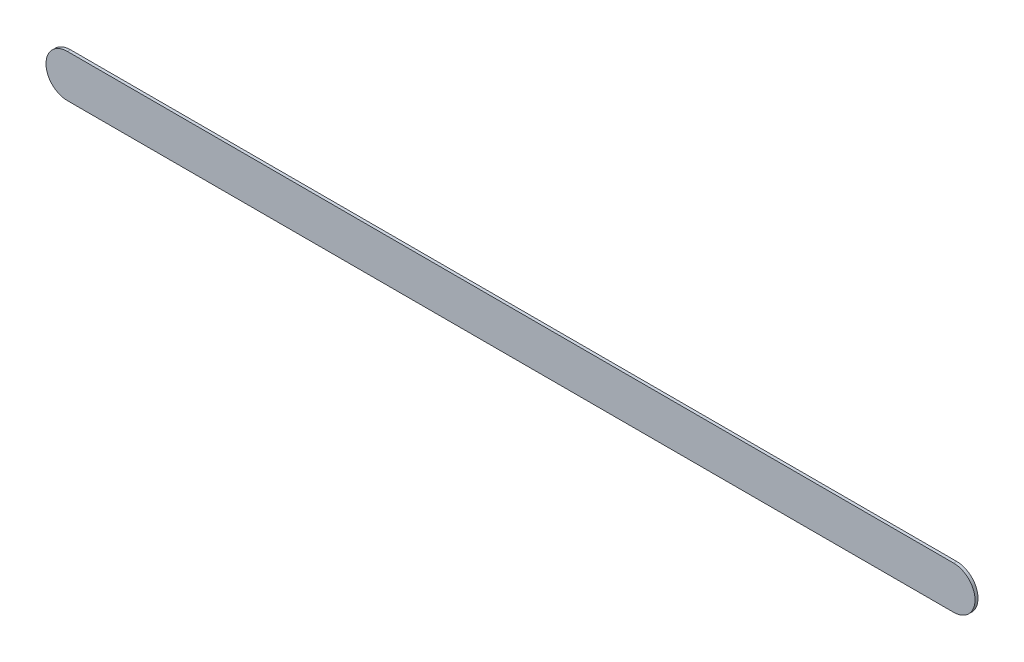
ISO-10303-21;
HEADER;
FILE_DESCRIPTION(('STEP AP214'),'2;1');
FILE_NAME('part.step','',(''),(''),'','','');
FILE_SCHEMA(('AUTOMOTIVE_DESIGN { 1 0 10303 214 1 1 1 1 }'));
ENDSEC;
DATA;
#1=APPLICATION_CONTEXT('core data for automotive mechanical design processes');
#2=APPLICATION_PROTOCOL_DEFINITION('international standard','automotive_design',2000,#1);
#3=PRODUCT_CONTEXT('',#1,'mechanical');
#4=PRODUCT('Part','Part','',(#3));
#5=PRODUCT_RELATED_PRODUCT_CATEGORY('part','',(#4));
#6=PRODUCT_DEFINITION_FORMATION('','',#4);
#7=PRODUCT_DEFINITION_CONTEXT('part definition',#1,'design');
#8=PRODUCT_DEFINITION('design','',#6,#7);
#9=PRODUCT_DEFINITION_SHAPE('','',#8);
#10=(LENGTH_UNIT() NAMED_UNIT(*) SI_UNIT(.MILLI.,.METRE.));
#11=(NAMED_UNIT(*) PLANE_ANGLE_UNIT() SI_UNIT($,.RADIAN.));
#12=(NAMED_UNIT(*) SI_UNIT($,.STERADIAN.) SOLID_ANGLE_UNIT());
#13=UNCERTAINTY_MEASURE_WITH_UNIT(LENGTH_MEASURE(1.E-05),#10,'distance_accuracy_value','');
#14=(GEOMETRIC_REPRESENTATION_CONTEXT(3) GLOBAL_UNCERTAINTY_ASSIGNED_CONTEXT((#13)) GLOBAL_UNIT_ASSIGNED_CONTEXT((#10,
#11,#12)) REPRESENTATION_CONTEXT('',''));
#15=CARTESIAN_POINT('',(0.,0.,0.));
#16=DIRECTION('',(0.,0.,1.));
#17=DIRECTION('',(1.,0.,0.));
#18=AXIS2_PLACEMENT_3D('',#15,#16,#17);
#19=CARTESIAN_POINT('',(137.66,-56.63,1.635));
#20=DIRECTION('',(0.,0.,1.));
#21=DIRECTION('',(1.,0.,0.));
#22=AXIS2_PLACEMENT_3D('',#19,#20,#21);
#23=PLANE('',#22);
#24=DIRECTION('',(1.,0.,0.));
#25=VECTOR('',#24,1.);
#26=CARTESIAN_POINT('',(137.66,-56.63,1.635));
#27=LINE('',#26,#25);
#28=CARTESIAN_POINT('',(137.66,-56.63,1.635));
#29=VERTEX_POINT('',#28);
#30=CARTESIAN_POINT('',(148.05,-56.63,1.635));
#31=VERTEX_POINT('',#30);
#32=EDGE_CURVE('E78',#29,#31,#27,.T.);
#33=ORIENTED_EDGE('',*,*,#32,.T.);
#34=CARTESIAN_POINT('',(148.05,-56.38,1.635));
#35=DIRECTION('',(0.,0.,1.));
#36=DIRECTION('',(0.,-1.,0.));
#37=AXIS2_PLACEMENT_3D('',#34,#35,#36);
#38=CIRCLE('',#37,0.25);
#39=CARTESIAN_POINT('',(148.05,-56.13,1.635));
#40=VERTEX_POINT('',#39);
#41=EDGE_CURVE('E76',#31,#40,#38,.T.);
#42=ORIENTED_EDGE('',*,*,#41,.T.);
#43=DIRECTION('',(-1.,0.,0.));
#44=VECTOR('',#43,1.);
#45=CARTESIAN_POINT('',(148.05,-56.13,1.635));
#46=LINE('',#45,#44);
#47=CARTESIAN_POINT('',(137.66,-56.13,1.635));
#48=VERTEX_POINT('',#47);
#49=EDGE_CURVE('E65',#40,#48,#46,.T.);
#50=ORIENTED_EDGE('',*,*,#49,.T.);
#51=CARTESIAN_POINT('',(137.66,-56.38,1.635));
#52=DIRECTION('',(0.,0.,1.));
#53=DIRECTION('',(0.,1.,0.));
#54=AXIS2_PLACEMENT_3D('',#51,#52,#53);
#55=CIRCLE('',#54,0.25);
#56=EDGE_CURVE('E11',#48,#29,#55,.T.);
#57=ORIENTED_EDGE('',*,*,#56,.T.);
#58=EDGE_LOOP('',(#33,#42,#50,#57));
#59=FACE_BOUND('',#58,.T.);
#60=ADVANCED_FACE('F17',(#59),#23,.T.);
#61=CARTESIAN_POINT('',(137.66,-56.63,1.6));
#62=DIRECTION('',(0.,0.,1.));
#63=DIRECTION('',(1.,0.,0.));
#64=AXIS2_PLACEMENT_3D('',#61,#62,#63);
#65=PLANE('',#64);
#66=CARTESIAN_POINT('',(137.66,-56.38,1.6));
#67=DIRECTION('',(0.,0.,1.));
#68=DIRECTION('',(0.,1.,0.));
#69=AXIS2_PLACEMENT_3D('',#66,#67,#68);
#70=CIRCLE('',#69,0.25);
#71=CARTESIAN_POINT('',(137.66,-56.13,1.6));
#72=VERTEX_POINT('',#71);
#73=CARTESIAN_POINT('',(137.66,-56.63,1.6));
#74=VERTEX_POINT('',#73);
#75=EDGE_CURVE('E26',#72,#74,#70,.T.);
#76=ORIENTED_EDGE('',*,*,#75,.F.);
#77=DIRECTION('',(-1.,0.,0.));
#78=VECTOR('',#77,1.);
#79=CARTESIAN_POINT('',(148.05,-56.13,1.6));
#80=LINE('',#79,#78);
#81=CARTESIAN_POINT('',(148.05,-56.13,1.6));
#82=VERTEX_POINT('',#81);
#83=EDGE_CURVE('E83',#82,#72,#80,.T.);
#84=ORIENTED_EDGE('',*,*,#83,.F.);
#85=CARTESIAN_POINT('',(148.05,-56.38,1.6));
#86=DIRECTION('',(0.,0.,1.));
#87=DIRECTION('',(0.,-1.,0.));
#88=AXIS2_PLACEMENT_3D('',#85,#86,#87);
#89=CIRCLE('',#88,0.25);
#90=CARTESIAN_POINT('',(148.05,-56.63,1.6));
#91=VERTEX_POINT('',#90);
#92=EDGE_CURVE('E86',#91,#82,#89,.T.);
#93=ORIENTED_EDGE('',*,*,#92,.F.);
#94=DIRECTION('',(1.,0.,0.));
#95=VECTOR('',#94,1.);
#96=CARTESIAN_POINT('',(137.66,-56.63,1.6));
#97=LINE('',#96,#95);
#98=EDGE_CURVE('E118',#74,#91,#97,.T.);
#99=ORIENTED_EDGE('',*,*,#98,.F.);
#100=EDGE_LOOP('',(#76,#84,#93,#99));
#101=FACE_BOUND('',#100,.T.);
#102=ADVANCED_FACE('F149',(#101),#65,.F.);
#103=CARTESIAN_POINT('',(137.66,-56.38,1.6));
#104=DIRECTION('',(0.,0.,-1.));
#105=DIRECTION('',(0.,1.,0.));
#106=AXIS2_PLACEMENT_3D('',#103,#104,#105);
#107=CYLINDRICAL_SURFACE('',#106,0.25);
#108=ORIENTED_EDGE('',*,*,#75,.T.);
#109=DIRECTION('',(0.,0.,1.));
#110=VECTOR('',#109,1.);
#111=CARTESIAN_POINT('',(137.66,-56.63,1.6));
#112=LINE('',#111,#110);
#113=EDGE_CURVE('E93',#74,#29,#112,.T.);
#114=ORIENTED_EDGE('',*,*,#113,.T.);
#115=ORIENTED_EDGE('',*,*,#56,.F.);
#116=DIRECTION('',(0.,0.,1.));
#117=VECTOR('',#116,1.);
#118=CARTESIAN_POINT('',(137.66,-56.13,1.6));
#119=LINE('',#118,#117);
#120=EDGE_CURVE('E72',#72,#48,#119,.T.);
#121=ORIENTED_EDGE('',*,*,#120,.F.);
#122=EDGE_LOOP('',(#108,#114,#115,#121));
#123=FACE_BOUND('',#122,.T.);
#124=ADVANCED_FACE('F144',(#123),#107,.T.);
#125=CARTESIAN_POINT('',(148.05,-56.13,1.6));
#126=DIRECTION('',(0.,-1.,0.));
#127=DIRECTION('',(0.,0.,-1.));
#128=AXIS2_PLACEMENT_3D('',#125,#126,#127);
#129=PLANE('',#128);
#130=ORIENTED_EDGE('',*,*,#83,.T.);
#131=ORIENTED_EDGE('',*,*,#120,.T.);
#132=ORIENTED_EDGE('',*,*,#49,.F.);
#133=DIRECTION('',(0.,0.,1.));
#134=VECTOR('',#133,1.);
#135=CARTESIAN_POINT('',(148.05,-56.13,1.6));
#136=LINE('',#135,#134);
#137=EDGE_CURVE('E70',#82,#40,#136,.T.);
#138=ORIENTED_EDGE('',*,*,#137,.F.);
#139=EDGE_LOOP('',(#130,#131,#132,#138));
#140=FACE_BOUND('',#139,.T.);
#141=ADVANCED_FACE('F68',(#140),#129,.F.);
#142=CARTESIAN_POINT('',(148.05,-56.38,1.6));
#143=DIRECTION('',(0.,0.,-1.));
#144=DIRECTION('',(0.,-1.,0.));
#145=AXIS2_PLACEMENT_3D('',#142,#143,#144);
#146=CYLINDRICAL_SURFACE('',#145,0.25);
#147=ORIENTED_EDGE('',*,*,#92,.T.);
#148=ORIENTED_EDGE('',*,*,#137,.T.);
#149=ORIENTED_EDGE('',*,*,#41,.F.);
#150=DIRECTION('',(0.,0.,1.));
#151=VECTOR('',#150,1.);
#152=CARTESIAN_POINT('',(148.05,-56.63,1.6));
#153=LINE('',#152,#151);
#154=EDGE_CURVE('E126',#91,#31,#153,.T.);
#155=ORIENTED_EDGE('',*,*,#154,.F.);
#156=EDGE_LOOP('',(#147,#148,#149,#155));
#157=FACE_BOUND('',#156,.T.);
#158=ADVANCED_FACE('F85',(#157),#146,.T.);
#159=CARTESIAN_POINT('',(137.66,-56.63,1.6));
#160=DIRECTION('',(0.,1.,0.));
#161=DIRECTION('',(1.,0.,0.));
#162=AXIS2_PLACEMENT_3D('',#159,#160,#161);
#163=PLANE('',#162);
#164=ORIENTED_EDGE('',*,*,#98,.T.);
#165=ORIENTED_EDGE('',*,*,#154,.T.);
#166=ORIENTED_EDGE('',*,*,#32,.F.);
#167=ORIENTED_EDGE('',*,*,#113,.F.);
#168=EDGE_LOOP('',(#164,#165,#166,#167));
#169=FACE_BOUND('',#168,.T.);
#170=ADVANCED_FACE('F148',(#169),#163,.F.);
#171=CLOSED_SHELL('',(#60,#102,#124,#141,#158,#170));
#172=MANIFOLD_SOLID_BREP('B1',#171);
#173=ADVANCED_BREP_SHAPE_REPRESENTATION('',(#18,#172),#14);
#174=SHAPE_DEFINITION_REPRESENTATION(#9,#173);
ENDSEC;
END-ISO-10303-21;
